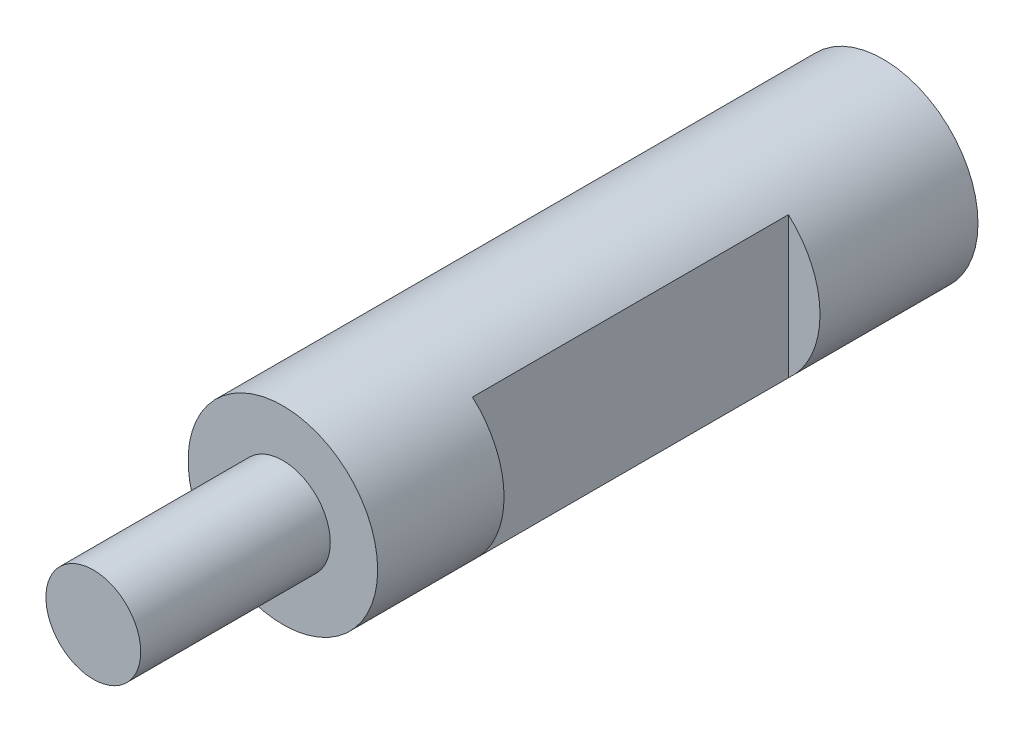
ISO-10303-21;
HEADER;
FILE_DESCRIPTION(('STEP AP214'),'2;1');
FILE_NAME('part.step','',(''),(''),'','','');
FILE_SCHEMA(('AUTOMOTIVE_DESIGN { 1 0 10303 214 1 1 1 1 }'));
ENDSEC;
DATA;
#1=APPLICATION_CONTEXT('core data for automotive mechanical design processes');
#2=APPLICATION_PROTOCOL_DEFINITION('international standard','automotive_design',2000,#1);
#3=PRODUCT_CONTEXT('',#1,'mechanical');
#4=PRODUCT('Part','Part','',(#3));
#5=PRODUCT_RELATED_PRODUCT_CATEGORY('part','',(#4));
#6=PRODUCT_DEFINITION_FORMATION('','',#4);
#7=PRODUCT_DEFINITION_CONTEXT('part definition',#1,'design');
#8=PRODUCT_DEFINITION('design','',#6,#7);
#9=PRODUCT_DEFINITION_SHAPE('','',#8);
#10=(LENGTH_UNIT() NAMED_UNIT(*) SI_UNIT(.MILLI.,.METRE.));
#11=(NAMED_UNIT(*) PLANE_ANGLE_UNIT() SI_UNIT($,.RADIAN.));
#12=(NAMED_UNIT(*) SI_UNIT($,.STERADIAN.) SOLID_ANGLE_UNIT());
#13=UNCERTAINTY_MEASURE_WITH_UNIT(LENGTH_MEASURE(1.E-05),#10,'distance_accuracy_value','');
#14=(GEOMETRIC_REPRESENTATION_CONTEXT(3) GLOBAL_UNCERTAINTY_ASSIGNED_CONTEXT((#13)) GLOBAL_UNIT_ASSIGNED_CONTEXT((#10,
#11,#12)) REPRESENTATION_CONTEXT('',''));
#15=CARTESIAN_POINT('',(0.,0.,0.));
#16=DIRECTION('',(0.,0.,1.));
#17=DIRECTION('',(1.,0.,0.));
#18=AXIS2_PLACEMENT_3D('',#15,#16,#17);
#19=CARTESIAN_POINT('',(0.,0.,19.));
#20=DIRECTION('',(0.,0.,1.));
#21=DIRECTION('',(1.,0.,0.));
#22=AXIS2_PLACEMENT_3D('',#19,#20,#21);
#23=PLANE('',#22);
#24=CARTESIAN_POINT('',(0.,0.,19.));
#25=DIRECTION('',(0.,0.,1.));
#26=DIRECTION('',(1.,0.,0.));
#27=AXIS2_PLACEMENT_3D('',#24,#25,#26);
#28=CIRCLE('',#27,3.);
#29=CARTESIAN_POINT('',(3.,0.,19.));
#30=VERTEX_POINT('',#29);
#31=EDGE_CURVE('E103',#30,#30,#28,.T.);
#32=ORIENTED_EDGE('',*,*,#31,.T.);
#33=EDGE_LOOP('',(#32));
#34=FACE_BOUND('',#33,.T.);
#35=CARTESIAN_POINT('',(0.,0.,19.));
#36=DIRECTION('',(0.,0.,1.));
#37=DIRECTION('',(1.,0.,0.));
#38=AXIS2_PLACEMENT_3D('',#35,#36,#37);
#39=CIRCLE('',#38,1.5);
#40=CARTESIAN_POINT('',(1.5,0.,19.));
#41=VERTEX_POINT('',#40);
#42=EDGE_CURVE('E171',#41,#41,#39,.T.);
#43=ORIENTED_EDGE('',*,*,#42,.F.);
#44=EDGE_LOOP('',(#43));
#45=FACE_BOUND('',#44,.T.);
#46=ADVANCED_FACE('F36',(#34,#45),#23,.T.);
#47=CARTESIAN_POINT('',(0.,0.,19.));
#48=DIRECTION('',(0.,0.,-1.));
#49=DIRECTION('',(-1.,0.,0.));
#50=AXIS2_PLACEMENT_3D('',#47,#48,#49);
#51=CYLINDRICAL_SURFACE('',#50,3.);
#52=CARTESIAN_POINT('',(0.,0.,15.));
#53=DIRECTION('',(0.,0.,1.));
#54=DIRECTION('',(1.,0.,0.));
#55=AXIS2_PLACEMENT_3D('',#52,#53,#54);
#56=CIRCLE('',#55,3.);
#57=CARTESIAN_POINT('',(2.,-2.23606797749979,15.));
#58=VERTEX_POINT('',#57);
#59=CARTESIAN_POINT('',(2.,2.23606797749979,15.));
#60=VERTEX_POINT('',#59);
#61=EDGE_CURVE('E11',#58,#60,#56,.T.);
#62=ORIENTED_EDGE('',*,*,#61,.T.);
#63=DIRECTION('',(0.,0.,-1.));
#64=VECTOR('',#63,1.);
#65=CARTESIAN_POINT('',(2.,2.23606797749979,19.));
#66=LINE('',#65,#64);
#67=CARTESIAN_POINT('',(2.,2.23606797749979,5.));
#68=VERTEX_POINT('',#67);
#69=EDGE_CURVE('E44',#60,#68,#66,.T.);
#70=ORIENTED_EDGE('',*,*,#69,.T.);
#71=CARTESIAN_POINT('',(0.,0.,5.));
#72=DIRECTION('',(0.,0.,-1.));
#73=DIRECTION('',(-1.,0.,0.));
#74=AXIS2_PLACEMENT_3D('',#71,#72,#73);
#75=CIRCLE('',#74,3.);
#76=CARTESIAN_POINT('',(2.,-2.23606797749979,5.));
#77=VERTEX_POINT('',#76);
#78=EDGE_CURVE('E119',#68,#77,#75,.T.);
#79=ORIENTED_EDGE('',*,*,#78,.T.);
#80=DIRECTION('',(0.,0.,-1.));
#81=VECTOR('',#80,1.);
#82=CARTESIAN_POINT('',(2.,-2.23606797749979,19.));
#83=LINE('',#82,#81);
#84=EDGE_CURVE('E122',#77,#58,#83,.F.);
#85=ORIENTED_EDGE('',*,*,#84,.T.);
#86=EDGE_LOOP('',(#62,#70,#79,#85));
#87=FACE_BOUND('',#86,.T.);
#88=CARTESIAN_POINT('',(0.,0.,5.));
#89=DIRECTION('',(0.,0.,-1.));
#90=DIRECTION('',(-1.,0.,0.));
#91=AXIS2_PLACEMENT_3D('',#88,#89,#90);
#92=CIRCLE('',#91,3.);
#93=CARTESIAN_POINT('',(-2.,-2.23606797749979,5.));
#94=VERTEX_POINT('',#93);
#95=CARTESIAN_POINT('',(-2.,2.23606797749979,5.));
#96=VERTEX_POINT('',#95);
#97=EDGE_CURVE('E117',#94,#96,#92,.T.);
#98=ORIENTED_EDGE('',*,*,#97,.T.);
#99=DIRECTION('',(0.,0.,-1.));
#100=VECTOR('',#99,1.);
#101=CARTESIAN_POINT('',(-2.,2.23606797749979,19.));
#102=LINE('',#101,#100);
#103=CARTESIAN_POINT('',(-2.,2.23606797749979,15.));
#104=VERTEX_POINT('',#103);
#105=EDGE_CURVE('E111',#96,#104,#102,.F.);
#106=ORIENTED_EDGE('',*,*,#105,.T.);
#107=CARTESIAN_POINT('',(0.,0.,15.));
#108=DIRECTION('',(0.,0.,1.));
#109=DIRECTION('',(1.,0.,0.));
#110=AXIS2_PLACEMENT_3D('',#107,#108,#109);
#111=CIRCLE('',#110,3.);
#112=CARTESIAN_POINT('',(-2.,-2.23606797749979,15.));
#113=VERTEX_POINT('',#112);
#114=EDGE_CURVE('E106',#104,#113,#111,.T.);
#115=ORIENTED_EDGE('',*,*,#114,.T.);
#116=DIRECTION('',(0.,0.,-1.));
#117=VECTOR('',#116,1.);
#118=CARTESIAN_POINT('',(-2.,-2.23606797749979,19.));
#119=LINE('',#118,#117);
#120=EDGE_CURVE('E114',#113,#94,#119,.T.);
#121=ORIENTED_EDGE('',*,*,#120,.T.);
#122=EDGE_LOOP('',(#98,#106,#115,#121));
#123=FACE_BOUND('',#122,.T.);
#124=ORIENTED_EDGE('',*,*,#31,.F.);
#125=EDGE_LOOP('',(#124));
#126=FACE_BOUND('',#125,.T.);
#127=CARTESIAN_POINT('',(0.,0.,0.));
#128=DIRECTION('',(0.,0.,1.));
#129=DIRECTION('',(1.,0.,0.));
#130=AXIS2_PLACEMENT_3D('',#127,#128,#129);
#131=CIRCLE('',#130,3.);
#132=CARTESIAN_POINT('',(3.,0.,0.));
#133=VERTEX_POINT('',#132);
#134=EDGE_CURVE('E101',#133,#133,#131,.T.);
#135=ORIENTED_EDGE('',*,*,#134,.T.);
#136=EDGE_LOOP('',(#135));
#137=FACE_BOUND('',#136,.T.);
#138=ADVANCED_FACE('F38',(#87,#123,#126,#137),#51,.T.);
#139=CARTESIAN_POINT('',(0.,0.,0.));
#140=DIRECTION('',(0.,0.,1.));
#141=DIRECTION('',(1.,0.,0.));
#142=AXIS2_PLACEMENT_3D('',#139,#140,#141);
#143=PLANE('',#142);
#144=CARTESIAN_POINT('',(0.,0.,0.));
#145=DIRECTION('',(0.,0.,-1.));
#146=DIRECTION('',(-1.,0.,0.));
#147=AXIS2_PLACEMENT_3D('',#144,#145,#146);
#148=CIRCLE('',#147,1.5);
#149=CARTESIAN_POINT('',(-1.5,0.,0.));
#150=VERTEX_POINT('',#149);
#151=EDGE_CURVE('E163',#150,#150,#148,.T.);
#152=ORIENTED_EDGE('',*,*,#151,.F.);
#153=EDGE_LOOP('',(#152));
#154=FACE_BOUND('',#153,.T.);
#155=ORIENTED_EDGE('',*,*,#134,.F.);
#156=EDGE_LOOP('',(#155));
#157=FACE_BOUND('',#156,.T.);
#158=ADVANCED_FACE('F149',(#154,#157),#143,.F.);
#159=CARTESIAN_POINT('',(-3.,-9.25,5.));
#160=DIRECTION('',(0.,0.,-1.));
#161=DIRECTION('',(-1.,0.,0.));
#162=AXIS2_PLACEMENT_3D('',#159,#160,#161);
#163=PLANE('',#162);
#164=ORIENTED_EDGE('',*,*,#97,.F.);
#165=DIRECTION('',(0.,1.,0.));
#166=VECTOR('',#165,1.);
#167=CARTESIAN_POINT('',(-2.,-9.25,5.));
#168=LINE('',#167,#166);
#169=EDGE_CURVE('E98',#94,#96,#168,.T.);
#170=ORIENTED_EDGE('',*,*,#169,.T.);
#171=EDGE_LOOP('',(#164,#170));
#172=FACE_BOUND('',#171,.T.);
#173=ADVANCED_FACE('F153',(#172),#163,.F.);
#174=CARTESIAN_POINT('',(-2.,-9.25,5.));
#175=DIRECTION('',(1.,0.,0.));
#176=DIRECTION('',(0.,0.,-1.));
#177=AXIS2_PLACEMENT_3D('',#174,#175,#176);
#178=PLANE('',#177);
#179=DIRECTION('',(0.,1.,0.));
#180=VECTOR('',#179,1.);
#181=CARTESIAN_POINT('',(-2.,-9.25,15.));
#182=LINE('',#181,#180);
#183=EDGE_CURVE('E57',#113,#104,#182,.T.);
#184=ORIENTED_EDGE('',*,*,#183,.T.);
#185=ORIENTED_EDGE('',*,*,#105,.F.);
#186=ORIENTED_EDGE('',*,*,#169,.F.);
#187=ORIENTED_EDGE('',*,*,#120,.F.);
#188=EDGE_LOOP('',(#184,#185,#186,#187));
#189=FACE_BOUND('',#188,.T.);
#190=ADVANCED_FACE('F141',(#189),#178,.F.);
#191=CARTESIAN_POINT('',(-3.,-9.25,15.));
#192=DIRECTION('',(0.,0.,1.));
#193=DIRECTION('',(1.,0.,0.));
#194=AXIS2_PLACEMENT_3D('',#191,#192,#193);
#195=PLANE('',#194);
#196=ORIENTED_EDGE('',*,*,#183,.F.);
#197=ORIENTED_EDGE('',*,*,#114,.F.);
#198=EDGE_LOOP('',(#196,#197));
#199=FACE_BOUND('',#198,.T.);
#200=ADVANCED_FACE('F134',(#199),#195,.F.);
#201=CARTESIAN_POINT('',(3.,-9.25,15.));
#202=DIRECTION('',(0.,0.,1.));
#203=DIRECTION('',(1.,0.,0.));
#204=AXIS2_PLACEMENT_3D('',#201,#202,#203);
#205=PLANE('',#204);
#206=ORIENTED_EDGE('',*,*,#61,.F.);
#207=DIRECTION('',(0.,1.,0.));
#208=VECTOR('',#207,1.);
#209=CARTESIAN_POINT('',(2.,-9.25,15.));
#210=LINE('',#209,#208);
#211=EDGE_CURVE('E89',#58,#60,#210,.T.);
#212=ORIENTED_EDGE('',*,*,#211,.T.);
#213=EDGE_LOOP('',(#206,#212));
#214=FACE_BOUND('',#213,.T.);
#215=ADVANCED_FACE('F132',(#214),#205,.F.);
#216=CARTESIAN_POINT('',(2.,-9.25,5.));
#217=DIRECTION('',(-1.,0.,0.));
#218=DIRECTION('',(0.,0.,1.));
#219=AXIS2_PLACEMENT_3D('',#216,#217,#218);
#220=PLANE('',#219);
#221=ORIENTED_EDGE('',*,*,#211,.F.);
#222=ORIENTED_EDGE('',*,*,#84,.F.);
#223=DIRECTION('',(0.,1.,0.));
#224=VECTOR('',#223,1.);
#225=CARTESIAN_POINT('',(2.,-9.25,5.));
#226=LINE('',#225,#224);
#227=EDGE_CURVE('E50',#77,#68,#226,.T.);
#228=ORIENTED_EDGE('',*,*,#227,.T.);
#229=ORIENTED_EDGE('',*,*,#69,.F.);
#230=EDGE_LOOP('',(#221,#222,#228,#229));
#231=FACE_BOUND('',#230,.T.);
#232=ADVANCED_FACE('F130',(#231),#220,.F.);
#233=CARTESIAN_POINT('',(3.,-9.25,5.));
#234=DIRECTION('',(0.,0.,-1.));
#235=DIRECTION('',(-1.,0.,0.));
#236=AXIS2_PLACEMENT_3D('',#233,#234,#235);
#237=PLANE('',#236);
#238=ORIENTED_EDGE('',*,*,#227,.F.);
#239=ORIENTED_EDGE('',*,*,#78,.F.);
#240=EDGE_LOOP('',(#238,#239));
#241=FACE_BOUND('',#240,.T.);
#242=ADVANCED_FACE('F81',(#241),#237,.F.);
#243=CARTESIAN_POINT('',(0.,0.,7.5));
#244=DIRECTION('',(0.,0.,-1.));
#245=DIRECTION('',(-1.,0.,0.));
#246=AXIS2_PLACEMENT_3D('',#243,#244,#245);
#247=CONICAL_SURFACE('',#246,1.25,1.02974425867665);
#248=CARTESIAN_POINT('',(0.,0.,8.25107577378445));
#249=VERTEX_POINT('',#248);
#250=VERTEX_LOOP('',#249);
#251=FACE_BOUND('',#250,.T.);
#252=CARTESIAN_POINT('',(0.,0.,7.5));
#253=DIRECTION('',(0.,0.,-1.));
#254=DIRECTION('',(-1.,0.,0.));
#255=AXIS2_PLACEMENT_3D('',#252,#253,#254);
#256=CIRCLE('',#255,1.25);
#257=CARTESIAN_POINT('',(-1.25,0.,7.5));
#258=VERTEX_POINT('',#257);
#259=EDGE_CURVE('E85',#258,#258,#256,.T.);
#260=ORIENTED_EDGE('',*,*,#259,.T.);
#261=EDGE_LOOP('',(#260));
#262=FACE_BOUND('',#261,.T.);
#263=ADVANCED_FACE('F77',(#251,#262),#247,.F.);
#264=CARTESIAN_POINT('',(0.,0.,0.));
#265=DIRECTION('',(0.,0.,-1.));
#266=DIRECTION('',(-1.,0.,0.));
#267=AXIS2_PLACEMENT_3D('',#264,#265,#266);
#268=CYLINDRICAL_SURFACE('',#267,1.25);
#269=ORIENTED_EDGE('',*,*,#259,.F.);
#270=EDGE_LOOP('',(#269));
#271=FACE_BOUND('',#270,.T.);
#272=CARTESIAN_POINT('',(0.,0.,6.));
#273=DIRECTION('',(0.,0.,-1.));
#274=DIRECTION('',(-1.,0.,0.));
#275=AXIS2_PLACEMENT_3D('',#272,#273,#274);
#276=CIRCLE('',#275,1.25);
#277=CARTESIAN_POINT('',(-1.25,0.,6.));
#278=VERTEX_POINT('',#277);
#279=EDGE_CURVE('E87',#278,#278,#276,.T.);
#280=ORIENTED_EDGE('',*,*,#279,.T.);
#281=EDGE_LOOP('',(#280));
#282=FACE_BOUND('',#281,.T.);
#283=ADVANCED_FACE('F80',(#271,#282),#268,.F.);
#284=CARTESIAN_POINT('',(1.25,0.,6.));
#285=DIRECTION('',(0.,0.,1.));
#286=DIRECTION('',(1.,0.,0.));
#287=AXIS2_PLACEMENT_3D('',#284,#285,#286);
#288=PLANE('',#287);
#289=ORIENTED_EDGE('',*,*,#279,.F.);
#290=EDGE_LOOP('',(#289));
#291=FACE_BOUND('',#290,.T.);
#292=CARTESIAN_POINT('',(0.,0.,6.));
#293=DIRECTION('',(0.,0.,-1.));
#294=DIRECTION('',(-1.,0.,0.));
#295=AXIS2_PLACEMENT_3D('',#292,#293,#294);
#296=CIRCLE('',#295,1.5);
#297=CARTESIAN_POINT('',(-1.5,0.,6.));
#298=VERTEX_POINT('',#297);
#299=EDGE_CURVE('E92',#298,#298,#296,.T.);
#300=ORIENTED_EDGE('',*,*,#299,.T.);
#301=EDGE_LOOP('',(#300));
#302=FACE_BOUND('',#301,.T.);
#303=ADVANCED_FACE('F189',(#291,#302),#288,.F.);
#304=CARTESIAN_POINT('',(0.,0.,0.));
#305=DIRECTION('',(0.,0.,-1.));
#306=DIRECTION('',(-1.,0.,0.));
#307=AXIS2_PLACEMENT_3D('',#304,#305,#306);
#308=CYLINDRICAL_SURFACE('',#307,1.5);
#309=ORIENTED_EDGE('',*,*,#299,.F.);
#310=EDGE_LOOP('',(#309));
#311=FACE_BOUND('',#310,.T.);
#312=ORIENTED_EDGE('',*,*,#151,.T.);
#313=EDGE_LOOP('',(#312));
#314=FACE_BOUND('',#313,.T.);
#315=ADVANCED_FACE('F180',(#311,#314),#308,.F.);
#316=CARTESIAN_POINT('',(0.,0.,25.));
#317=DIRECTION('',(0.,0.,-1.));
#318=DIRECTION('',(-1.,0.,0.));
#319=AXIS2_PLACEMENT_3D('',#316,#317,#318);
#320=CYLINDRICAL_SURFACE('',#319,1.5);
#321=CARTESIAN_POINT('',(0.,0.,25.));
#322=DIRECTION('',(0.,0.,1.));
#323=DIRECTION('',(1.,0.,0.));
#324=AXIS2_PLACEMENT_3D('',#321,#322,#323);
#325=CIRCLE('',#324,1.5);
#326=CARTESIAN_POINT('',(1.5,0.,25.));
#327=VERTEX_POINT('',#326);
#328=EDGE_CURVE('E167',#327,#327,#325,.T.);
#329=ORIENTED_EDGE('',*,*,#328,.F.);
#330=EDGE_LOOP('',(#329));
#331=FACE_BOUND('',#330,.T.);
#332=ORIENTED_EDGE('',*,*,#42,.T.);
#333=EDGE_LOOP('',(#332));
#334=FACE_BOUND('',#333,.T.);
#335=ADVANCED_FACE('F177',(#331,#334),#320,.T.);
#336=CARTESIAN_POINT('',(0.,0.,25.));
#337=DIRECTION('',(0.,0.,1.));
#338=DIRECTION('',(1.,0.,0.));
#339=AXIS2_PLACEMENT_3D('',#336,#337,#338);
#340=PLANE('',#339);
#341=ORIENTED_EDGE('',*,*,#328,.T.);
#342=EDGE_LOOP('',(#341));
#343=FACE_BOUND('',#342,.T.);
#344=ADVANCED_FACE('F179',(#343),#340,.T.);
#345=CLOSED_SHELL('',(#46,#138,#158,#173,#190,#200,#215,#232,#242,#263,#283,#303,#315,#335,#344));
#346=MANIFOLD_SOLID_BREP('B2',#345);
#347=ADVANCED_BREP_SHAPE_REPRESENTATION('',(#18,#346),#14);
#348=SHAPE_DEFINITION_REPRESENTATION(#9,#347);
ENDSEC;
END-ISO-10303-21;
